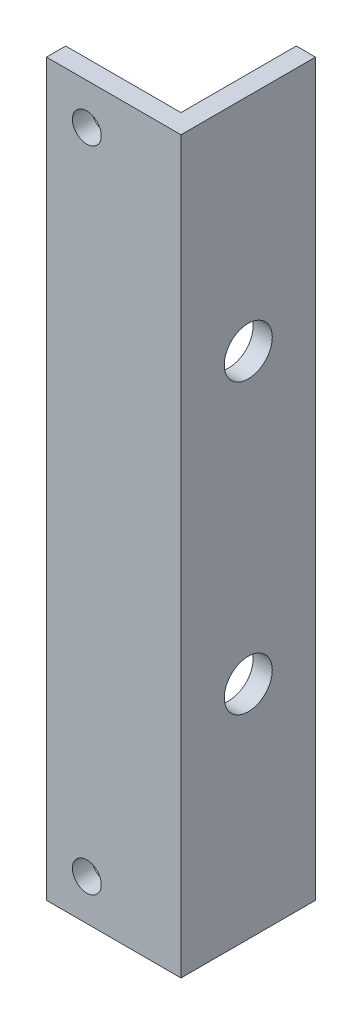
ISO-10303-21;
HEADER;
FILE_DESCRIPTION(('STEP AP214'),'2;1');
FILE_NAME('part.step','',(''),(''),'','','');
FILE_SCHEMA(('AUTOMOTIVE_DESIGN { 1 0 10303 214 1 1 1 1 }'));
ENDSEC;
DATA;
#1=APPLICATION_CONTEXT('core data for automotive mechanical design processes');
#2=APPLICATION_PROTOCOL_DEFINITION('international standard','automotive_design',2000,#1);
#3=PRODUCT_CONTEXT('',#1,'mechanical');
#4=PRODUCT('Part','Part','',(#3));
#5=PRODUCT_RELATED_PRODUCT_CATEGORY('part','',(#4));
#6=PRODUCT_DEFINITION_FORMATION('','',#4);
#7=PRODUCT_DEFINITION_CONTEXT('part definition',#1,'design');
#8=PRODUCT_DEFINITION('design','',#6,#7);
#9=PRODUCT_DEFINITION_SHAPE('','',#8);
#10=(LENGTH_UNIT() NAMED_UNIT(*) SI_UNIT(.MILLI.,.METRE.));
#11=(NAMED_UNIT(*) PLANE_ANGLE_UNIT() SI_UNIT($,.RADIAN.));
#12=(NAMED_UNIT(*) SI_UNIT($,.STERADIAN.) SOLID_ANGLE_UNIT());
#13=UNCERTAINTY_MEASURE_WITH_UNIT(LENGTH_MEASURE(1.E-05),#10,'distance_accuracy_value','');
#14=(GEOMETRIC_REPRESENTATION_CONTEXT(3) GLOBAL_UNCERTAINTY_ASSIGNED_CONTEXT((#13)) GLOBAL_UNIT_ASSIGNED_CONTEXT((#10,
#11,#12)) REPRESENTATION_CONTEXT('',''));
#15=CARTESIAN_POINT('',(0.,0.,0.));
#16=DIRECTION('',(0.,0.,1.));
#17=DIRECTION('',(1.,0.,0.));
#18=AXIS2_PLACEMENT_3D('',#15,#16,#17);
#19=CARTESIAN_POINT('',(0.,76.,-2.));
#20=DIRECTION('',(1.,0.,0.));
#21=DIRECTION('',(0.,0.,-1.));
#22=AXIS2_PLACEMENT_3D('',#19,#20,#21);
#23=PLANE('',#22);
#24=DIRECTION('',(0.,0.,1.));
#25=VECTOR('',#24,1.);
#26=CARTESIAN_POINT('',(0.,0.,-2.));
#27=LINE('',#26,#25);
#28=CARTESIAN_POINT('',(0.,0.,-2.));
#29=VERTEX_POINT('',#28);
#30=CARTESIAN_POINT('',(0.,0.,0.));
#31=VERTEX_POINT('',#30);
#32=EDGE_CURVE('E121',#29,#31,#27,.T.);
#33=ORIENTED_EDGE('',*,*,#32,.T.);
#34=DIRECTION('',(0.,-1.,0.));
#35=VECTOR('',#34,1.);
#36=CARTESIAN_POINT('',(0.,76.,0.));
#37=LINE('',#36,#35);
#38=CARTESIAN_POINT('',(0.,76.,0.));
#39=VERTEX_POINT('',#38);
#40=EDGE_CURVE('E11',#39,#31,#37,.T.);
#41=ORIENTED_EDGE('',*,*,#40,.F.);
#42=DIRECTION('',(0.,0.,1.));
#43=VECTOR('',#42,1.);
#44=CARTESIAN_POINT('',(0.,76.,-2.));
#45=LINE('',#44,#43);
#46=CARTESIAN_POINT('',(0.,76.,-2.));
#47=VERTEX_POINT('',#46);
#48=EDGE_CURVE('E132',#47,#39,#45,.T.);
#49=ORIENTED_EDGE('',*,*,#48,.F.);
#50=DIRECTION('',(0.,-1.,0.));
#51=VECTOR('',#50,1.);
#52=CARTESIAN_POINT('',(0.,76.,-2.));
#53=LINE('',#52,#51);
#54=EDGE_CURVE('E117',#47,#29,#53,.T.);
#55=ORIENTED_EDGE('',*,*,#54,.T.);
#56=EDGE_LOOP('',(#33,#41,#49,#55));
#57=FACE_BOUND('',#56,.T.);
#58=ADVANCED_FACE('F35',(#57),#23,.F.);
#59=CARTESIAN_POINT('',(0.,76.,0.));
#60=DIRECTION('',(0.,0.,-1.));
#61=DIRECTION('',(-1.,0.,0.));
#62=AXIS2_PLACEMENT_3D('',#59,#60,#61);
#63=PLANE('',#62);
#64=CARTESIAN_POINT('',(4.2,4.25,0.));
#65=DIRECTION('',(0.,0.,1.));
#66=DIRECTION('',(1.,0.,0.));
#67=AXIS2_PLACEMENT_3D('',#64,#65,#66);
#68=CIRCLE('',#67,1.5);
#69=CARTESIAN_POINT('',(5.7,4.25,0.));
#70=VERTEX_POINT('',#69);
#71=EDGE_CURVE('E141',#70,#70,#68,.T.);
#72=ORIENTED_EDGE('',*,*,#71,.F.);
#73=EDGE_LOOP('',(#72));
#74=FACE_BOUND('',#73,.T.);
#75=CARTESIAN_POINT('',(4.2,71.75,0.));
#76=DIRECTION('',(0.,0.,1.));
#77=DIRECTION('',(1.,0.,0.));
#78=AXIS2_PLACEMENT_3D('',#75,#76,#77);
#79=CIRCLE('',#78,1.5);
#80=CARTESIAN_POINT('',(5.7,71.75,0.));
#81=VERTEX_POINT('',#80);
#82=EDGE_CURVE('E149',#81,#81,#79,.T.);
#83=ORIENTED_EDGE('',*,*,#82,.F.);
#84=EDGE_LOOP('',(#83));
#85=FACE_BOUND('',#84,.T.);
#86=DIRECTION('',(1.,0.,0.));
#87=VECTOR('',#86,1.);
#88=CARTESIAN_POINT('',(0.,0.,0.));
#89=LINE('',#88,#87);
#90=CARTESIAN_POINT('',(14.,0.,0.));
#91=VERTEX_POINT('',#90);
#92=EDGE_CURVE('E124',#31,#91,#89,.T.);
#93=ORIENTED_EDGE('',*,*,#92,.T.);
#94=DIRECTION('',(0.,-1.,0.));
#95=VECTOR('',#94,1.);
#96=CARTESIAN_POINT('',(14.,76.,0.));
#97=LINE('',#96,#95);
#98=CARTESIAN_POINT('',(14.,76.,0.));
#99=VERTEX_POINT('',#98);
#100=EDGE_CURVE('E44',#99,#91,#97,.T.);
#101=ORIENTED_EDGE('',*,*,#100,.F.);
#102=DIRECTION('',(1.,0.,0.));
#103=VECTOR('',#102,1.);
#104=CARTESIAN_POINT('',(0.,76.,0.));
#105=LINE('',#104,#103);
#106=EDGE_CURVE('E90',#39,#99,#105,.T.);
#107=ORIENTED_EDGE('',*,*,#106,.F.);
#108=ORIENTED_EDGE('',*,*,#40,.T.);
#109=EDGE_LOOP('',(#93,#101,#107,#108));
#110=FACE_BOUND('',#109,.T.);
#111=ADVANCED_FACE('F165',(#74,#85,#110),#63,.F.);
#112=CARTESIAN_POINT('',(14.,76.,0.));
#113=DIRECTION('',(-1.,0.,0.));
#114=DIRECTION('',(0.,0.,1.));
#115=AXIS2_PLACEMENT_3D('',#112,#113,#114);
#116=PLANE('',#115);
#117=CARTESIAN_POINT('',(14.,23.,-7.));
#118=DIRECTION('',(1.,0.,0.));
#119=DIRECTION('',(0.,0.,-1.));
#120=AXIS2_PLACEMENT_3D('',#117,#118,#119);
#121=CIRCLE('',#120,2.5);
#122=CARTESIAN_POINT('',(14.,23.,-9.5));
#123=VERTEX_POINT('',#122);
#124=EDGE_CURVE('E145',#123,#123,#121,.T.);
#125=ORIENTED_EDGE('',*,*,#124,.F.);
#126=EDGE_LOOP('',(#125));
#127=FACE_BOUND('',#126,.T.);
#128=CARTESIAN_POINT('',(14.,53.,-7.));
#129=DIRECTION('',(1.,0.,0.));
#130=DIRECTION('',(0.,0.,-1.));
#131=AXIS2_PLACEMENT_3D('',#128,#129,#130);
#132=CIRCLE('',#131,2.5);
#133=CARTESIAN_POINT('',(14.,53.,-9.5));
#134=VERTEX_POINT('',#133);
#135=EDGE_CURVE('E151',#134,#134,#132,.T.);
#136=ORIENTED_EDGE('',*,*,#135,.F.);
#137=EDGE_LOOP('',(#136));
#138=FACE_BOUND('',#137,.T.);
#139=DIRECTION('',(0.,0.,-1.));
#140=VECTOR('',#139,1.);
#141=CARTESIAN_POINT('',(14.,0.,0.));
#142=LINE('',#141,#140);
#143=CARTESIAN_POINT('',(14.,0.,-14.));
#144=VERTEX_POINT('',#143);
#145=EDGE_CURVE('E127',#91,#144,#142,.T.);
#146=ORIENTED_EDGE('',*,*,#145,.T.);
#147=DIRECTION('',(0.,-1.,0.));
#148=VECTOR('',#147,1.);
#149=CARTESIAN_POINT('',(14.,76.,-14.));
#150=LINE('',#149,#148);
#151=CARTESIAN_POINT('',(14.,76.,-14.));
#152=VERTEX_POINT('',#151);
#153=EDGE_CURVE('E112',#152,#144,#150,.T.);
#154=ORIENTED_EDGE('',*,*,#153,.F.);
#155=DIRECTION('',(0.,0.,-1.));
#156=VECTOR('',#155,1.);
#157=CARTESIAN_POINT('',(14.,76.,0.));
#158=LINE('',#157,#156);
#159=EDGE_CURVE('E103',#99,#152,#158,.T.);
#160=ORIENTED_EDGE('',*,*,#159,.F.);
#161=ORIENTED_EDGE('',*,*,#100,.T.);
#162=EDGE_LOOP('',(#146,#154,#160,#161));
#163=FACE_BOUND('',#162,.T.);
#164=ADVANCED_FACE('F168',(#127,#138,#163),#116,.F.);
#165=CARTESIAN_POINT('',(14.,76.,-14.));
#166=DIRECTION('',(0.,0.,1.));
#167=DIRECTION('',(1.,0.,0.));
#168=AXIS2_PLACEMENT_3D('',#165,#166,#167);
#169=PLANE('',#168);
#170=DIRECTION('',(-1.,0.,0.));
#171=VECTOR('',#170,1.);
#172=CARTESIAN_POINT('',(14.,0.,-14.));
#173=LINE('',#172,#171);
#174=CARTESIAN_POINT('',(12.,0.,-14.));
#175=VERTEX_POINT('',#174);
#176=EDGE_CURVE('E111',#144,#175,#173,.T.);
#177=ORIENTED_EDGE('',*,*,#176,.T.);
#178=DIRECTION('',(0.,-1.,0.));
#179=VECTOR('',#178,1.);
#180=CARTESIAN_POINT('',(12.,76.,-14.));
#181=LINE('',#180,#179);
#182=CARTESIAN_POINT('',(12.,76.,-14.));
#183=VERTEX_POINT('',#182);
#184=EDGE_CURVE('E108',#183,#175,#181,.T.);
#185=ORIENTED_EDGE('',*,*,#184,.F.);
#186=DIRECTION('',(-1.,0.,0.));
#187=VECTOR('',#186,1.);
#188=CARTESIAN_POINT('',(14.,76.,-14.));
#189=LINE('',#188,#187);
#190=EDGE_CURVE('E97',#152,#183,#189,.T.);
#191=ORIENTED_EDGE('',*,*,#190,.F.);
#192=ORIENTED_EDGE('',*,*,#153,.T.);
#193=EDGE_LOOP('',(#177,#185,#191,#192));
#194=FACE_BOUND('',#193,.T.);
#195=ADVANCED_FACE('F109',(#194),#169,.F.);
#196=CARTESIAN_POINT('',(12.,76.,-14.));
#197=DIRECTION('',(1.,0.,0.));
#198=DIRECTION('',(0.,0.,-1.));
#199=AXIS2_PLACEMENT_3D('',#196,#197,#198);
#200=PLANE('',#199);
#201=CARTESIAN_POINT('',(12.,23.,-7.));
#202=DIRECTION('',(1.,0.,0.));
#203=DIRECTION('',(0.,0.,-1.));
#204=AXIS2_PLACEMENT_3D('',#201,#202,#203);
#205=CIRCLE('',#204,2.5);
#206=CARTESIAN_POINT('',(12.,23.,-9.5));
#207=VERTEX_POINT('',#206);
#208=EDGE_CURVE('E38',#207,#207,#205,.T.);
#209=ORIENTED_EDGE('',*,*,#208,.T.);
#210=EDGE_LOOP('',(#209));
#211=FACE_BOUND('',#210,.T.);
#212=CARTESIAN_POINT('',(12.,53.,-7.));
#213=DIRECTION('',(1.,0.,0.));
#214=DIRECTION('',(0.,0.,-1.));
#215=AXIS2_PLACEMENT_3D('',#212,#213,#214);
#216=CIRCLE('',#215,2.5);
#217=CARTESIAN_POINT('',(12.,53.,-9.5));
#218=VERTEX_POINT('',#217);
#219=EDGE_CURVE('E143',#218,#218,#216,.T.);
#220=ORIENTED_EDGE('',*,*,#219,.T.);
#221=EDGE_LOOP('',(#220));
#222=FACE_BOUND('',#221,.T.);
#223=DIRECTION('',(0.,0.,1.));
#224=VECTOR('',#223,1.);
#225=CARTESIAN_POINT('',(12.,0.,-14.));
#226=LINE('',#225,#224);
#227=CARTESIAN_POINT('',(12.,0.,-2.));
#228=VERTEX_POINT('',#227);
#229=EDGE_CURVE('E76',#175,#228,#226,.T.);
#230=ORIENTED_EDGE('',*,*,#229,.T.);
#231=DIRECTION('',(0.,-1.,0.));
#232=VECTOR('',#231,1.);
#233=CARTESIAN_POINT('',(12.,76.,-2.));
#234=LINE('',#233,#232);
#235=CARTESIAN_POINT('',(12.,76.,-2.));
#236=VERTEX_POINT('',#235);
#237=EDGE_CURVE('E113',#236,#228,#234,.T.);
#238=ORIENTED_EDGE('',*,*,#237,.F.);
#239=DIRECTION('',(0.,0.,1.));
#240=VECTOR('',#239,1.);
#241=CARTESIAN_POINT('',(12.,76.,-14.));
#242=LINE('',#241,#240);
#243=EDGE_CURVE('E101',#183,#236,#242,.T.);
#244=ORIENTED_EDGE('',*,*,#243,.F.);
#245=ORIENTED_EDGE('',*,*,#184,.T.);
#246=EDGE_LOOP('',(#230,#238,#244,#245));
#247=FACE_BOUND('',#246,.T.);
#248=ADVANCED_FACE('F115',(#211,#222,#247),#200,.F.);
#249=CARTESIAN_POINT('',(12.,76.,-2.));
#250=DIRECTION('',(0.,0.,1.));
#251=DIRECTION('',(1.,0.,0.));
#252=AXIS2_PLACEMENT_3D('',#249,#250,#251);
#253=PLANE('',#252);
#254=CARTESIAN_POINT('',(4.2,4.25,-2.));
#255=DIRECTION('',(0.,0.,1.));
#256=DIRECTION('',(1.,0.,0.));
#257=AXIS2_PLACEMENT_3D('',#254,#255,#256);
#258=CIRCLE('',#257,1.5);
#259=CARTESIAN_POINT('',(5.7,4.25,-2.));
#260=VERTEX_POINT('',#259);
#261=EDGE_CURVE('E125',#260,#260,#258,.T.);
#262=ORIENTED_EDGE('',*,*,#261,.T.);
#263=EDGE_LOOP('',(#262));
#264=FACE_BOUND('',#263,.T.);
#265=CARTESIAN_POINT('',(4.2,71.75,-2.));
#266=DIRECTION('',(0.,0.,1.));
#267=DIRECTION('',(1.,0.,0.));
#268=AXIS2_PLACEMENT_3D('',#265,#266,#267);
#269=CIRCLE('',#268,1.5);
#270=CARTESIAN_POINT('',(5.7,71.75,-2.));
#271=VERTEX_POINT('',#270);
#272=EDGE_CURVE('E138',#271,#271,#269,.T.);
#273=ORIENTED_EDGE('',*,*,#272,.T.);
#274=EDGE_LOOP('',(#273));
#275=FACE_BOUND('',#274,.T.);
#276=DIRECTION('',(-1.,0.,0.));
#277=VECTOR('',#276,1.);
#278=CARTESIAN_POINT('',(12.,0.,-2.));
#279=LINE('',#278,#277);
#280=EDGE_CURVE('E82',#228,#29,#279,.T.);
#281=ORIENTED_EDGE('',*,*,#280,.T.);
#282=ORIENTED_EDGE('',*,*,#54,.F.);
#283=DIRECTION('',(-1.,0.,0.));
#284=VECTOR('',#283,1.);
#285=CARTESIAN_POINT('',(12.,76.,-2.));
#286=LINE('',#285,#284);
#287=EDGE_CURVE('E53',#236,#47,#286,.T.);
#288=ORIENTED_EDGE('',*,*,#287,.F.);
#289=ORIENTED_EDGE('',*,*,#237,.T.);
#290=EDGE_LOOP('',(#281,#282,#288,#289));
#291=FACE_BOUND('',#290,.T.);
#292=ADVANCED_FACE('F173',(#264,#275,#291),#253,.F.);
#293=CARTESIAN_POINT('',(0.,76.,0.));
#294=DIRECTION('',(0.,1.,0.));
#295=DIRECTION('',(0.,0.,1.));
#296=AXIS2_PLACEMENT_3D('',#293,#294,#295);
#297=PLANE('',#296);
#298=ORIENTED_EDGE('',*,*,#48,.T.);
#299=ORIENTED_EDGE('',*,*,#106,.T.);
#300=ORIENTED_EDGE('',*,*,#159,.T.);
#301=ORIENTED_EDGE('',*,*,#190,.T.);
#302=ORIENTED_EDGE('',*,*,#243,.T.);
#303=ORIENTED_EDGE('',*,*,#287,.T.);
#304=EDGE_LOOP('',(#298,#299,#300,#301,#302,#303));
#305=FACE_BOUND('',#304,.T.);
#306=ADVANCED_FACE('F99',(#305),#297,.T.);
#307=CARTESIAN_POINT('',(0.,0.,0.));
#308=DIRECTION('',(0.,1.,0.));
#309=DIRECTION('',(0.,0.,1.));
#310=AXIS2_PLACEMENT_3D('',#307,#308,#309);
#311=PLANE('',#310);
#312=ORIENTED_EDGE('',*,*,#32,.F.);
#313=ORIENTED_EDGE('',*,*,#280,.F.);
#314=ORIENTED_EDGE('',*,*,#229,.F.);
#315=ORIENTED_EDGE('',*,*,#176,.F.);
#316=ORIENTED_EDGE('',*,*,#145,.F.);
#317=ORIENTED_EDGE('',*,*,#92,.F.);
#318=EDGE_LOOP('',(#312,#313,#314,#315,#316,#317));
#319=FACE_BOUND('',#318,.T.);
#320=ADVANCED_FACE('F171',(#319),#311,.F.);
#321=CARTESIAN_POINT('',(4.2,71.75,-76.));
#322=DIRECTION('',(0.,0.,1.));
#323=DIRECTION('',(1.,0.,0.));
#324=AXIS2_PLACEMENT_3D('',#321,#322,#323);
#325=CYLINDRICAL_SURFACE('',#324,1.5);
#326=ORIENTED_EDGE('',*,*,#82,.T.);
#327=EDGE_LOOP('',(#326));
#328=FACE_BOUND('',#327,.T.);
#329=ORIENTED_EDGE('',*,*,#272,.F.);
#330=EDGE_LOOP('',(#329));
#331=FACE_BOUND('',#330,.T.);
#332=ADVANCED_FACE('F242',(#328,#331),#325,.F.);
#333=CARTESIAN_POINT('',(4.2,4.25,-76.));
#334=DIRECTION('',(0.,0.,1.));
#335=DIRECTION('',(1.,0.,0.));
#336=AXIS2_PLACEMENT_3D('',#333,#334,#335);
#337=CYLINDRICAL_SURFACE('',#336,1.5);
#338=ORIENTED_EDGE('',*,*,#71,.T.);
#339=EDGE_LOOP('',(#338));
#340=FACE_BOUND('',#339,.T.);
#341=ORIENTED_EDGE('',*,*,#261,.F.);
#342=EDGE_LOOP('',(#341));
#343=FACE_BOUND('',#342,.T.);
#344=ADVANCED_FACE('F224',(#340,#343),#337,.F.);
#345=CARTESIAN_POINT('',(-62.,53.,-7.));
#346=DIRECTION('',(1.,0.,0.));
#347=DIRECTION('',(0.,0.,-1.));
#348=AXIS2_PLACEMENT_3D('',#345,#346,#347);
#349=CYLINDRICAL_SURFACE('',#348,2.5);
#350=ORIENTED_EDGE('',*,*,#135,.T.);
#351=EDGE_LOOP('',(#350));
#352=FACE_BOUND('',#351,.T.);
#353=ORIENTED_EDGE('',*,*,#219,.F.);
#354=EDGE_LOOP('',(#353));
#355=FACE_BOUND('',#354,.T.);
#356=ADVANCED_FACE('F218',(#352,#355),#349,.F.);
#357=CARTESIAN_POINT('',(-62.,23.,-7.));
#358=DIRECTION('',(1.,0.,0.));
#359=DIRECTION('',(0.,0.,-1.));
#360=AXIS2_PLACEMENT_3D('',#357,#358,#359);
#361=CYLINDRICAL_SURFACE('',#360,2.5);
#362=ORIENTED_EDGE('',*,*,#124,.T.);
#363=EDGE_LOOP('',(#362));
#364=FACE_BOUND('',#363,.T.);
#365=ORIENTED_EDGE('',*,*,#208,.F.);
#366=EDGE_LOOP('',(#365));
#367=FACE_BOUND('',#366,.T.);
#368=ADVANCED_FACE('F223',(#364,#367),#361,.F.);
#369=CLOSED_SHELL('',(#58,#111,#164,#195,#248,#292,#306,#320,#332,#344,#356,#368));
#370=MANIFOLD_SOLID_BREP('B2',#369);
#371=ADVANCED_BREP_SHAPE_REPRESENTATION('',(#18,#370),#14);
#372=SHAPE_DEFINITION_REPRESENTATION(#9,#371);
ENDSEC;
END-ISO-10303-21;
